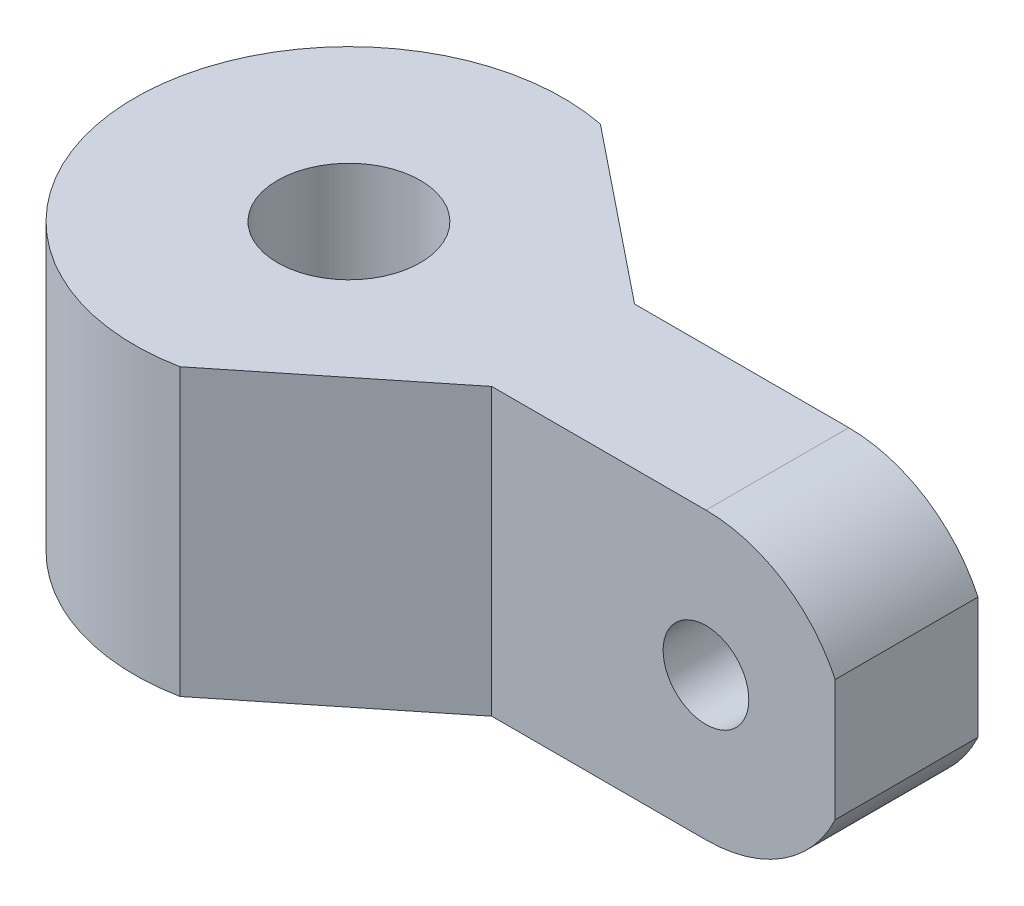
ISO-10303-21;
HEADER;
FILE_DESCRIPTION(('STEP AP214'),'2;1');
FILE_NAME('part.step','',(''),(''),'','','');
FILE_SCHEMA(('AUTOMOTIVE_DESIGN { 1 0 10303 214 1 1 1 1 }'));
ENDSEC;
DATA;
#1=APPLICATION_CONTEXT('core data for automotive mechanical design processes');
#2=APPLICATION_PROTOCOL_DEFINITION('international standard','automotive_design',2000,#1);
#3=PRODUCT_CONTEXT('',#1,'mechanical');
#4=PRODUCT('Part','Part','',(#3));
#5=PRODUCT_RELATED_PRODUCT_CATEGORY('part','',(#4));
#6=PRODUCT_DEFINITION_FORMATION('','',#4);
#7=PRODUCT_DEFINITION_CONTEXT('part definition',#1,'design');
#8=PRODUCT_DEFINITION('design','',#6,#7);
#9=PRODUCT_DEFINITION_SHAPE('','',#8);
#10=(LENGTH_UNIT() NAMED_UNIT(*) SI_UNIT(.MILLI.,.METRE.));
#11=(NAMED_UNIT(*) PLANE_ANGLE_UNIT() SI_UNIT($,.RADIAN.));
#12=(NAMED_UNIT(*) SI_UNIT($,.STERADIAN.) SOLID_ANGLE_UNIT());
#13=UNCERTAINTY_MEASURE_WITH_UNIT(LENGTH_MEASURE(1.E-05),#10,'distance_accuracy_value','');
#14=(GEOMETRIC_REPRESENTATION_CONTEXT(3) GLOBAL_UNCERTAINTY_ASSIGNED_CONTEXT((#13)) GLOBAL_UNIT_ASSIGNED_CONTEXT((#10,
#11,#12)) REPRESENTATION_CONTEXT('',''));
#15=CARTESIAN_POINT('',(0.,0.,0.));
#16=DIRECTION('',(0.,0.,1.));
#17=DIRECTION('',(1.,0.,0.));
#18=AXIS2_PLACEMENT_3D('',#15,#16,#17);
#19=CARTESIAN_POINT('',(5.,-5.,10.));
#20=DIRECTION('',(0.,1.,0.));
#21=DIRECTION('',(-1.,0.,0.));
#22=AXIS2_PLACEMENT_3D('',#19,#20,#21);
#23=PLANE('',#22);
#24=DIRECTION('',(1.,0.,0.));
#25=VECTOR('',#24,1.);
#26=CARTESIAN_POINT('',(-7.5,-5.,7.5));
#27=LINE('',#26,#25);
#28=CARTESIAN_POINT('',(-7.5,-5.,7.5));
#29=VERTEX_POINT('',#28);
#30=CARTESIAN_POINT('',(0.,-5.,7.5));
#31=VERTEX_POINT('',#30);
#32=EDGE_CURVE('E113',#29,#31,#27,.T.);
#33=ORIENTED_EDGE('',*,*,#32,.F.);
#34=DIRECTION('',(-0.779935503312325,0.,0.62585989700008));
#35=VECTOR('',#34,1.);
#36=CARTESIAN_POINT('',(-13.5560593621868,-5.,12.3596899007004));
#37=LINE('',#36,#35);
#38=CARTESIAN_POINT('',(-13.5560593621868,-5.,12.3596899007004));
#39=VERTEX_POINT('',#38);
#40=EDGE_CURVE('E98',#29,#39,#37,.T.);
#41=ORIENTED_EDGE('',*,*,#40,.T.);
#42=CARTESIAN_POINT('',(-15.,-5.,5.));
#43=DIRECTION('',(0.,1.,0.));
#44=DIRECTION('',(-1.,0.,0.));
#45=AXIS2_PLACEMENT_3D('',#42,#43,#44);
#46=CIRCLE('',#45,7.5);
#47=CARTESIAN_POINT('',(-13.5560593621868,-5.,-2.35968990070041));
#48=VERTEX_POINT('',#47);
#49=EDGE_CURVE('E110',#48,#39,#46,.T.);
#50=ORIENTED_EDGE('',*,*,#49,.F.);
#51=DIRECTION('',(0.779935503312325,0.,0.62585989700008));
#52=VECTOR('',#51,1.);
#53=CARTESIAN_POINT('',(-13.5560593621868,-5.,-2.35968990070041));
#54=LINE('',#53,#52);
#55=CARTESIAN_POINT('',(-7.5,-5.,2.5));
#56=VERTEX_POINT('',#55);
#57=EDGE_CURVE('E56',#48,#56,#54,.T.);
#58=ORIENTED_EDGE('',*,*,#57,.T.);
#59=DIRECTION('',(1.,0.,0.));
#60=VECTOR('',#59,1.);
#61=CARTESIAN_POINT('',(-7.5,-5.,2.5));
#62=LINE('',#61,#60);
#63=CARTESIAN_POINT('',(0.,-5.,2.5));
#64=VERTEX_POINT('',#63);
#65=EDGE_CURVE('E150',#56,#64,#62,.T.);
#66=ORIENTED_EDGE('',*,*,#65,.T.);
#67=DIRECTION('',(0.,0.,1.));
#68=VECTOR('',#67,1.);
#69=CARTESIAN_POINT('',(0.,-5.,0.));
#70=LINE('',#69,#68);
#71=EDGE_CURVE('E129',#64,#31,#70,.T.);
#72=ORIENTED_EDGE('',*,*,#71,.T.);
#73=EDGE_LOOP('',(#33,#41,#50,#58,#66,#72));
#74=FACE_BOUND('',#73,.T.);
#75=CARTESIAN_POINT('',(-15.,-5.,5.));
#76=DIRECTION('',(0.,1.,0.));
#77=DIRECTION('',(-1.,0.,0.));
#78=AXIS2_PLACEMENT_3D('',#75,#76,#77);
#79=CIRCLE('',#78,2.5);
#80=CARTESIAN_POINT('',(-17.5,-5.,5.));
#81=VERTEX_POINT('',#80);
#82=EDGE_CURVE('E157',#81,#81,#79,.T.);
#83=ORIENTED_EDGE('',*,*,#82,.T.);
#84=EDGE_LOOP('',(#83));
#85=FACE_BOUND('',#84,.T.);
#86=ADVANCED_FACE('F34',(#74,#85),#23,.F.);
#87=CARTESIAN_POINT('',(5.,5.,10.));
#88=DIRECTION('',(0.,-1.,0.));
#89=DIRECTION('',(1.,0.,0.));
#90=AXIS2_PLACEMENT_3D('',#87,#88,#89);
#91=PLANE('',#90);
#92=CARTESIAN_POINT('',(-15.,5.,5.));
#93=DIRECTION('',(0.,1.,0.));
#94=DIRECTION('',(-1.,0.,0.));
#95=AXIS2_PLACEMENT_3D('',#92,#93,#94);
#96=CIRCLE('',#95,7.5);
#97=CARTESIAN_POINT('',(-13.5560593621868,5.,-2.35968990070041));
#98=VERTEX_POINT('',#97);
#99=CARTESIAN_POINT('',(-13.5560593621868,5.,12.3596899007004));
#100=VERTEX_POINT('',#99);
#101=EDGE_CURVE('E118',#98,#100,#96,.T.);
#102=ORIENTED_EDGE('',*,*,#101,.T.);
#103=DIRECTION('',(-0.779935503312325,0.,0.62585989700008));
#104=VECTOR('',#103,1.);
#105=CARTESIAN_POINT('',(-13.5560593621868,5.,12.3596899007004));
#106=LINE('',#105,#104);
#107=CARTESIAN_POINT('',(-7.5,5.,7.5));
#108=VERTEX_POINT('',#107);
#109=EDGE_CURVE('E48',#108,#100,#106,.T.);
#110=ORIENTED_EDGE('',*,*,#109,.F.);
#111=DIRECTION('',(1.,0.,0.));
#112=VECTOR('',#111,1.);
#113=CARTESIAN_POINT('',(-7.5,5.,7.5));
#114=LINE('',#113,#112);
#115=CARTESIAN_POINT('',(0.,5.,7.5));
#116=VERTEX_POINT('',#115);
#117=EDGE_CURVE('E143',#108,#116,#114,.T.);
#118=ORIENTED_EDGE('',*,*,#117,.T.);
#119=DIRECTION('',(0.,0.,1.));
#120=VECTOR('',#119,1.);
#121=CARTESIAN_POINT('',(0.,5.,0.));
#122=LINE('',#121,#120);
#123=CARTESIAN_POINT('',(0.,5.,2.5));
#124=VERTEX_POINT('',#123);
#125=EDGE_CURVE('E126',#124,#116,#122,.T.);
#126=ORIENTED_EDGE('',*,*,#125,.F.);
#127=DIRECTION('',(1.,0.,0.));
#128=VECTOR('',#127,1.);
#129=CARTESIAN_POINT('',(-7.5,5.,2.5));
#130=LINE('',#129,#128);
#131=CARTESIAN_POINT('',(-7.5,5.,2.5));
#132=VERTEX_POINT('',#131);
#133=EDGE_CURVE('E147',#132,#124,#130,.T.);
#134=ORIENTED_EDGE('',*,*,#133,.F.);
#135=DIRECTION('',(0.779935503312325,0.,0.62585989700008));
#136=VECTOR('',#135,1.);
#137=CARTESIAN_POINT('',(-13.5560593621868,5.,-2.35968990070041));
#138=LINE('',#137,#136);
#139=EDGE_CURVE('E104',#98,#132,#138,.T.);
#140=ORIENTED_EDGE('',*,*,#139,.F.);
#141=EDGE_LOOP('',(#102,#110,#118,#126,#134,#140));
#142=FACE_BOUND('',#141,.T.);
#143=CARTESIAN_POINT('',(-15.,5.,5.));
#144=DIRECTION('',(0.,1.,0.));
#145=DIRECTION('',(-1.,0.,0.));
#146=AXIS2_PLACEMENT_3D('',#143,#144,#145);
#147=CIRCLE('',#146,2.5);
#148=CARTESIAN_POINT('',(-17.5,5.,5.));
#149=VERTEX_POINT('',#148);
#150=EDGE_CURVE('E154',#149,#149,#147,.T.);
#151=ORIENTED_EDGE('',*,*,#150,.F.);
#152=EDGE_LOOP('',(#151));
#153=FACE_BOUND('',#152,.T.);
#154=ADVANCED_FACE('F179',(#142,#153),#91,.F.);
#155=CARTESIAN_POINT('',(-15.,-9.00000000000001,5.));
#156=DIRECTION('',(0.,1.,0.));
#157=DIRECTION('',(-1.,0.,0.));
#158=AXIS2_PLACEMENT_3D('',#155,#156,#157);
#159=CYLINDRICAL_SURFACE('',#158,2.5);
#160=ORIENTED_EDGE('',*,*,#150,.T.);
#161=EDGE_LOOP('',(#160));
#162=FACE_BOUND('',#161,.T.);
#163=ORIENTED_EDGE('',*,*,#82,.F.);
#164=EDGE_LOOP('',(#163));
#165=FACE_BOUND('',#164,.T.);
#166=ADVANCED_FACE('F210',(#162,#165),#159,.F.);
#167=CARTESIAN_POINT('',(-7.5,-5.,2.5));
#168=DIRECTION('',(0.,0.,-1.));
#169=DIRECTION('',(-1.,0.,0.));
#170=AXIS2_PLACEMENT_3D('',#167,#168,#169);
#171=PLANE('',#170);
#172=CARTESIAN_POINT('',(0.,0.,2.5));
#173=DIRECTION('',(0.,0.,-1.));
#174=DIRECTION('',(-1.,0.,0.));
#175=AXIS2_PLACEMENT_3D('',#172,#173,#174);
#176=CIRCLE('',#175,5.);
#177=CARTESIAN_POINT('',(4.52508976466333,2.12686685566801,2.5));
#178=VERTEX_POINT('',#177);
#179=EDGE_CURVE('E136',#178,#124,#176,.F.);
#180=ORIENTED_EDGE('',*,*,#179,.F.);
#181=DIRECTION('',(0.,1.,0.));
#182=VECTOR('',#181,1.);
#183=CARTESIAN_POINT('',(4.52508976466333,-5.,2.5));
#184=LINE('',#183,#182);
#185=CARTESIAN_POINT('',(4.52508976466333,-2.12686685566801,2.5));
#186=VERTEX_POINT('',#185);
#187=EDGE_CURVE('E128',#186,#178,#184,.T.);
#188=ORIENTED_EDGE('',*,*,#187,.F.);
#189=CARTESIAN_POINT('',(0.,0.,2.5));
#190=DIRECTION('',(0.,0.,-1.));
#191=DIRECTION('',(-1.,0.,0.));
#192=AXIS2_PLACEMENT_3D('',#189,#190,#191);
#193=CIRCLE('',#192,5.);
#194=EDGE_CURVE('E134',#64,#186,#193,.F.);
#195=ORIENTED_EDGE('',*,*,#194,.F.);
#196=ORIENTED_EDGE('',*,*,#65,.F.);
#197=DIRECTION('',(0.,1.,0.));
#198=VECTOR('',#197,1.);
#199=CARTESIAN_POINT('',(-7.5,-5.,2.5));
#200=LINE('',#199,#198);
#201=EDGE_CURVE('E140',#56,#132,#200,.T.);
#202=ORIENTED_EDGE('',*,*,#201,.T.);
#203=ORIENTED_EDGE('',*,*,#133,.T.);
#204=EDGE_LOOP('',(#180,#188,#195,#196,#202,#203));
#205=FACE_BOUND('',#204,.T.);
#206=CARTESIAN_POINT('',(0.,0.,2.5));
#207=DIRECTION('',(0.,0.,-1.));
#208=DIRECTION('',(-1.,0.,0.));
#209=AXIS2_PLACEMENT_3D('',#206,#207,#208);
#210=CIRCLE('',#209,1.5);
#211=CARTESIAN_POINT('',(-1.5,0.,2.5));
#212=VERTEX_POINT('',#211);
#213=EDGE_CURVE('E146',#212,#212,#210,.T.);
#214=ORIENTED_EDGE('',*,*,#213,.F.);
#215=EDGE_LOOP('',(#214));
#216=FACE_BOUND('',#215,.T.);
#217=ADVANCED_FACE('F189',(#205,#216),#171,.T.);
#218=CARTESIAN_POINT('',(-7.5,-5.,7.5));
#219=DIRECTION('',(0.,0.,1.));
#220=DIRECTION('',(1.,0.,0.));
#221=AXIS2_PLACEMENT_3D('',#218,#219,#220);
#222=PLANE('',#221);
#223=CARTESIAN_POINT('',(0.,0.,7.5));
#224=DIRECTION('',(0.,0.,1.));
#225=DIRECTION('',(1.,0.,0.));
#226=AXIS2_PLACEMENT_3D('',#223,#224,#225);
#227=CIRCLE('',#226,5.);
#228=CARTESIAN_POINT('',(4.52508976466333,2.12686685566801,7.5));
#229=VERTEX_POINT('',#228);
#230=EDGE_CURVE('E12',#116,#229,#227,.F.);
#231=ORIENTED_EDGE('',*,*,#230,.F.);
#232=ORIENTED_EDGE('',*,*,#117,.F.);
#233=DIRECTION('',(0.,-1.,0.));
#234=VECTOR('',#233,1.);
#235=CARTESIAN_POINT('',(-7.5,-5.,7.5));
#236=LINE('',#235,#234);
#237=EDGE_CURVE('E138',#108,#29,#236,.T.);
#238=ORIENTED_EDGE('',*,*,#237,.T.);
#239=ORIENTED_EDGE('',*,*,#32,.T.);
#240=CARTESIAN_POINT('',(0.,0.,7.5));
#241=DIRECTION('',(0.,0.,1.));
#242=DIRECTION('',(1.,0.,0.));
#243=AXIS2_PLACEMENT_3D('',#240,#241,#242);
#244=CIRCLE('',#243,5.);
#245=CARTESIAN_POINT('',(4.52508976466333,-2.12686685566801,7.5));
#246=VERTEX_POINT('',#245);
#247=EDGE_CURVE('E41',#246,#31,#244,.F.);
#248=ORIENTED_EDGE('',*,*,#247,.F.);
#249=DIRECTION('',(0.,-1.,0.));
#250=VECTOR('',#249,1.);
#251=CARTESIAN_POINT('',(4.52508976466333,-5.,7.5));
#252=LINE('',#251,#250);
#253=EDGE_CURVE('E161',#229,#246,#252,.T.);
#254=ORIENTED_EDGE('',*,*,#253,.F.);
#255=EDGE_LOOP('',(#231,#232,#238,#239,#248,#254));
#256=FACE_BOUND('',#255,.T.);
#257=CARTESIAN_POINT('',(0.,0.,7.5));
#258=DIRECTION('',(0.,0.,1.));
#259=DIRECTION('',(1.,0.,0.));
#260=AXIS2_PLACEMENT_3D('',#257,#258,#259);
#261=CIRCLE('',#260,1.5);
#262=CARTESIAN_POINT('',(1.5,0.,7.5));
#263=VERTEX_POINT('',#262);
#264=EDGE_CURVE('E158',#263,#263,#261,.T.);
#265=ORIENTED_EDGE('',*,*,#264,.F.);
#266=EDGE_LOOP('',(#265));
#267=FACE_BOUND('',#266,.T.);
#268=ADVANCED_FACE('F175',(#256,#267),#222,.T.);
#269=CARTESIAN_POINT('',(0.,0.,10.));
#270=DIRECTION('',(0.,0.,-1.));
#271=DIRECTION('',(-1.,0.,0.));
#272=AXIS2_PLACEMENT_3D('',#269,#270,#271);
#273=CYLINDRICAL_SURFACE('',#272,1.5);
#274=ORIENTED_EDGE('',*,*,#213,.T.);
#275=EDGE_LOOP('',(#274));
#276=FACE_BOUND('',#275,.T.);
#277=ORIENTED_EDGE('',*,*,#264,.T.);
#278=EDGE_LOOP('',(#277));
#279=FACE_BOUND('',#278,.T.);
#280=ADVANCED_FACE('F217',(#276,#279),#273,.F.);
#281=CARTESIAN_POINT('',(0.,0.,0.));
#282=DIRECTION('',(0.,0.,1.));
#283=DIRECTION('',(1.,0.,0.));
#284=AXIS2_PLACEMENT_3D('',#281,#282,#283);
#285=CYLINDRICAL_SURFACE('',#284,5.);
#286=ORIENTED_EDGE('',*,*,#179,.T.);
#287=ORIENTED_EDGE('',*,*,#125,.T.);
#288=ORIENTED_EDGE('',*,*,#230,.T.);
#289=DIRECTION('',(0.,0.,1.));
#290=VECTOR('',#289,1.);
#291=CARTESIAN_POINT('',(4.52508976466333,2.12686685566801,0.));
#292=LINE('',#291,#290);
#293=EDGE_CURVE('E117',#178,#229,#292,.T.);
#294=ORIENTED_EDGE('',*,*,#293,.F.);
#295=EDGE_LOOP('',(#286,#287,#288,#294));
#296=FACE_BOUND('',#295,.T.);
#297=ADVANCED_FACE('F192',(#296),#285,.T.);
#298=CARTESIAN_POINT('',(0.,0.,0.));
#299=DIRECTION('',(0.,0.,1.));
#300=DIRECTION('',(1.,0.,0.));
#301=AXIS2_PLACEMENT_3D('',#298,#299,#300);
#302=CYLINDRICAL_SURFACE('',#301,5.);
#303=ORIENTED_EDGE('',*,*,#194,.T.);
#304=DIRECTION('',(0.,0.,1.));
#305=VECTOR('',#304,1.);
#306=CARTESIAN_POINT('',(4.52508976466333,-2.12686685566801,0.));
#307=LINE('',#306,#305);
#308=EDGE_CURVE('E120',#186,#246,#307,.T.);
#309=ORIENTED_EDGE('',*,*,#308,.T.);
#310=ORIENTED_EDGE('',*,*,#247,.T.);
#311=ORIENTED_EDGE('',*,*,#71,.F.);
#312=EDGE_LOOP('',(#303,#309,#310,#311));
#313=FACE_BOUND('',#312,.T.);
#314=ADVANCED_FACE('F168',(#313),#302,.T.);
#315=CARTESIAN_POINT('',(4.52508976466333,2.12686685566801,0.));
#316=DIRECTION('',(-1.,0.,0.));
#317=DIRECTION('',(0.,0.,1.));
#318=AXIS2_PLACEMENT_3D('',#315,#316,#317);
#319=PLANE('',#318);
#320=ORIENTED_EDGE('',*,*,#187,.T.);
#321=ORIENTED_EDGE('',*,*,#293,.T.);
#322=ORIENTED_EDGE('',*,*,#253,.T.);
#323=ORIENTED_EDGE('',*,*,#308,.F.);
#324=EDGE_LOOP('',(#320,#321,#322,#323));
#325=FACE_BOUND('',#324,.T.);
#326=ADVANCED_FACE('F195',(#325),#319,.F.);
#327=CARTESIAN_POINT('',(-15.,-5.,5.));
#328=DIRECTION('',(0.,1.,0.));
#329=DIRECTION('',(-1.,0.,0.));
#330=AXIS2_PLACEMENT_3D('',#327,#328,#329);
#331=CYLINDRICAL_SURFACE('',#330,7.5);
#332=DIRECTION('',(0.,1.,0.));
#333=VECTOR('',#332,1.);
#334=CARTESIAN_POINT('',(-13.5560593621868,-5.,12.3596899007004));
#335=LINE('',#334,#333);
#336=EDGE_CURVE('E95',#39,#100,#335,.T.);
#337=ORIENTED_EDGE('',*,*,#336,.T.);
#338=ORIENTED_EDGE('',*,*,#101,.F.);
#339=DIRECTION('',(0.,1.,0.));
#340=VECTOR('',#339,1.);
#341=CARTESIAN_POINT('',(-13.5560593621868,-5.,-2.35968990070041));
#342=LINE('',#341,#340);
#343=EDGE_CURVE('E116',#48,#98,#342,.T.);
#344=ORIENTED_EDGE('',*,*,#343,.F.);
#345=ORIENTED_EDGE('',*,*,#49,.T.);
#346=EDGE_LOOP('',(#337,#338,#344,#345));
#347=FACE_BOUND('',#346,.T.);
#348=ADVANCED_FACE('F115',(#347),#331,.T.);
#349=CARTESIAN_POINT('',(-13.5560593621868,-5.,-2.35968990070041));
#350=DIRECTION('',(-0.62585989700008,0.,0.779935503312325));
#351=DIRECTION('',(0.779935503312325,0.,0.62585989700008));
#352=AXIS2_PLACEMENT_3D('',#349,#350,#351);
#353=PLANE('',#352);
#354=ORIENTED_EDGE('',*,*,#139,.T.);
#355=ORIENTED_EDGE('',*,*,#201,.F.);
#356=ORIENTED_EDGE('',*,*,#57,.F.);
#357=ORIENTED_EDGE('',*,*,#343,.T.);
#358=EDGE_LOOP('',(#354,#355,#356,#357));
#359=FACE_BOUND('',#358,.T.);
#360=ADVANCED_FACE('F185',(#359),#353,.F.);
#361=CARTESIAN_POINT('',(-13.5560593621868,-5.,12.3596899007004));
#362=DIRECTION('',(-0.62585989700008,0.,-0.779935503312325));
#363=DIRECTION('',(-0.779935503312325,0.,0.62585989700008));
#364=AXIS2_PLACEMENT_3D('',#361,#362,#363);
#365=PLANE('',#364);
#366=ORIENTED_EDGE('',*,*,#109,.T.);
#367=ORIENTED_EDGE('',*,*,#336,.F.);
#368=ORIENTED_EDGE('',*,*,#40,.F.);
#369=ORIENTED_EDGE('',*,*,#237,.F.);
#370=EDGE_LOOP('',(#366,#367,#368,#369));
#371=FACE_BOUND('',#370,.T.);
#372=ADVANCED_FACE('F97',(#371),#365,.F.);
#373=CLOSED_SHELL('',(#86,#154,#166,#217,#268,#280,#297,#314,#326,#348,#360,#372));
#374=MANIFOLD_SOLID_BREP('B2',#373);
#375=ADVANCED_BREP_SHAPE_REPRESENTATION('',(#18,#374),#14);
#376=SHAPE_DEFINITION_REPRESENTATION(#9,#375);
ENDSEC;
END-ISO-10303-21;
